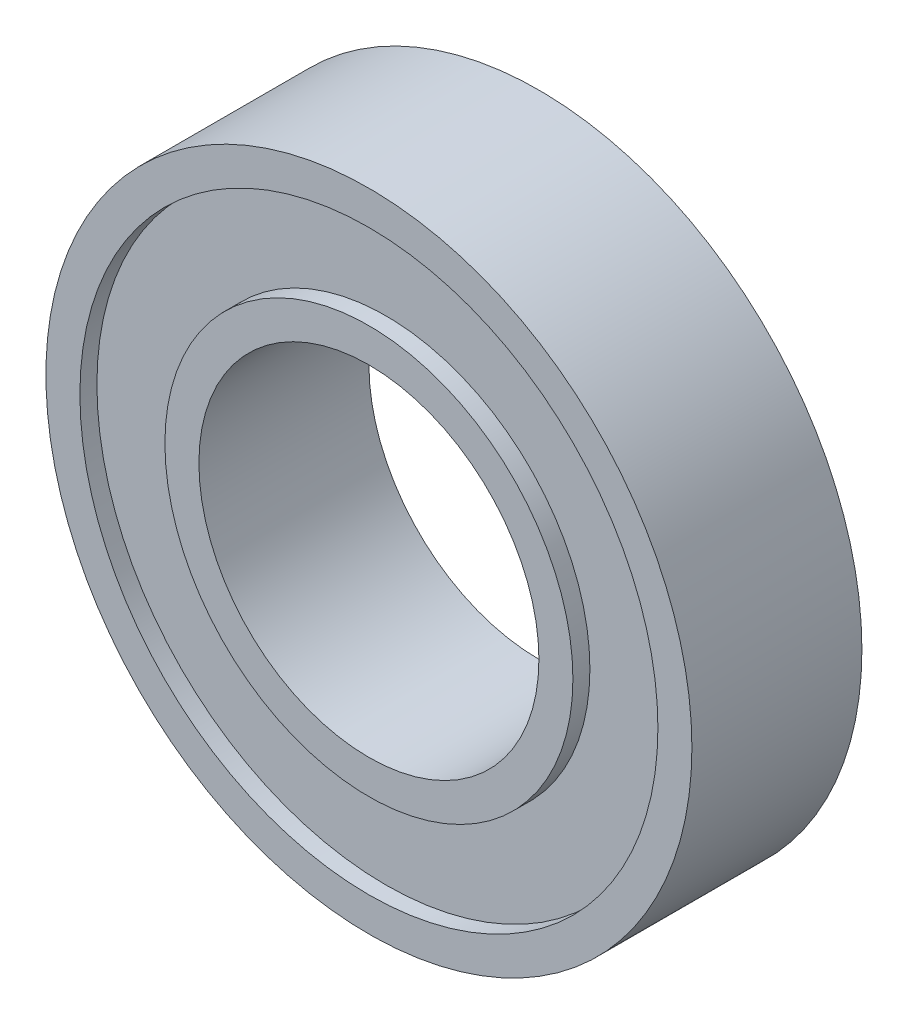
ISO-10303-21;
HEADER;
FILE_DESCRIPTION(('STEP AP214'),'2;1');
FILE_NAME('part.step','',(''),(''),'','','');
FILE_SCHEMA(('AUTOMOTIVE_DESIGN { 1 0 10303 214 1 1 1 1 }'));
ENDSEC;
DATA;
#1=APPLICATION_CONTEXT('core data for automotive mechanical design processes');
#2=APPLICATION_PROTOCOL_DEFINITION('international standard','automotive_design',2000,#1);
#3=PRODUCT_CONTEXT('',#1,'mechanical');
#4=PRODUCT('Part','Part','',(#3));
#5=PRODUCT_RELATED_PRODUCT_CATEGORY('part','',(#4));
#6=PRODUCT_DEFINITION_FORMATION('','',#4);
#7=PRODUCT_DEFINITION_CONTEXT('part definition',#1,'design');
#8=PRODUCT_DEFINITION('design','',#6,#7);
#9=PRODUCT_DEFINITION_SHAPE('','',#8);
#10=(LENGTH_UNIT() NAMED_UNIT(*) SI_UNIT(.MILLI.,.METRE.));
#11=(NAMED_UNIT(*) PLANE_ANGLE_UNIT() SI_UNIT($,.RADIAN.));
#12=(NAMED_UNIT(*) SI_UNIT($,.STERADIAN.) SOLID_ANGLE_UNIT());
#13=UNCERTAINTY_MEASURE_WITH_UNIT(LENGTH_MEASURE(1.E-05),#10,'distance_accuracy_value','');
#14=(GEOMETRIC_REPRESENTATION_CONTEXT(3) GLOBAL_UNCERTAINTY_ASSIGNED_CONTEXT((#13)) GLOBAL_UNIT_ASSIGNED_CONTEXT((#10,
#11,#12)) REPRESENTATION_CONTEXT('',''));
#15=CARTESIAN_POINT('',(0.,0.,0.));
#16=DIRECTION('',(0.,0.,1.));
#17=DIRECTION('',(1.,0.,0.));
#18=AXIS2_PLACEMENT_3D('',#15,#16,#17);
#19=CARTESIAN_POINT('',(0.,9.5,2.5));
#20=DIRECTION('',(0.,0.,-1.));
#21=DIRECTION('',(-1.,0.,0.));
#22=AXIS2_PLACEMENT_3D('',#19,#20,#21);
#23=PLANE('',#22);
#24=CARTESIAN_POINT('',(0.,0.,2.5));
#25=DIRECTION('',(0.,0.,1.));
#26=DIRECTION('',(1.,0.,0.));
#27=AXIS2_PLACEMENT_3D('',#24,#25,#26);
#28=CIRCLE('',#27,8.5);
#29=CARTESIAN_POINT('',(8.5,0.,2.5));
#30=VERTEX_POINT('',#29);
#31=EDGE_CURVE('E10',#30,#30,#28,.T.);
#32=ORIENTED_EDGE('',*,*,#31,.F.);
#33=EDGE_LOOP('',(#32));
#34=FACE_BOUND('',#33,.T.);
#35=CARTESIAN_POINT('',(0.,0.,2.5));
#36=DIRECTION('',(0.,0.,1.));
#37=DIRECTION('',(1.,0.,0.));
#38=AXIS2_PLACEMENT_3D('',#35,#36,#37);
#39=CIRCLE('',#38,9.5);
#40=CARTESIAN_POINT('',(9.5,0.,2.5));
#41=VERTEX_POINT('',#40);
#42=EDGE_CURVE('E72',#41,#41,#39,.T.);
#43=ORIENTED_EDGE('',*,*,#42,.T.);
#44=EDGE_LOOP('',(#43));
#45=FACE_BOUND('',#44,.T.);
#46=ADVANCED_FACE('F32',(#34,#45),#23,.F.);
#47=CARTESIAN_POINT('',(0.,0.,0.));
#48=DIRECTION('',(0.,0.,1.));
#49=DIRECTION('',(1.,0.,0.));
#50=AXIS2_PLACEMENT_3D('',#47,#48,#49);
#51=CYLINDRICAL_SURFACE('',#50,8.5);
#52=CARTESIAN_POINT('',(0.,0.,2.));
#53=DIRECTION('',(0.,0.,1.));
#54=DIRECTION('',(1.,0.,0.));
#55=AXIS2_PLACEMENT_3D('',#52,#53,#54);
#56=CIRCLE('',#55,8.5);
#57=CARTESIAN_POINT('',(8.5,0.,2.));
#58=VERTEX_POINT('',#57);
#59=EDGE_CURVE('E38',#58,#58,#56,.T.);
#60=ORIENTED_EDGE('',*,*,#59,.F.);
#61=EDGE_LOOP('',(#60));
#62=FACE_BOUND('',#61,.T.);
#63=ORIENTED_EDGE('',*,*,#31,.T.);
#64=EDGE_LOOP('',(#63));
#65=FACE_BOUND('',#64,.T.);
#66=ADVANCED_FACE('F133',(#62,#65),#51,.F.);
#67=CARTESIAN_POINT('',(0.,8.5,2.));
#68=DIRECTION('',(0.,0.,-1.));
#69=DIRECTION('',(-1.,0.,0.));
#70=AXIS2_PLACEMENT_3D('',#67,#68,#69);
#71=PLANE('',#70);
#72=CARTESIAN_POINT('',(0.,0.,2.));
#73=DIRECTION('',(0.,0.,1.));
#74=DIRECTION('',(1.,0.,0.));
#75=AXIS2_PLACEMENT_3D('',#72,#73,#74);
#76=CIRCLE('',#75,6.);
#77=CARTESIAN_POINT('',(6.,0.,2.));
#78=VERTEX_POINT('',#77);
#79=EDGE_CURVE('E42',#78,#78,#76,.T.);
#80=ORIENTED_EDGE('',*,*,#79,.F.);
#81=EDGE_LOOP('',(#80));
#82=FACE_BOUND('',#81,.T.);
#83=ORIENTED_EDGE('',*,*,#59,.T.);
#84=EDGE_LOOP('',(#83));
#85=FACE_BOUND('',#84,.T.);
#86=ADVANCED_FACE('F128',(#82,#85),#71,.F.);
#87=CARTESIAN_POINT('',(0.,0.,0.));
#88=DIRECTION('',(0.,0.,1.));
#89=DIRECTION('',(1.,0.,0.));
#90=AXIS2_PLACEMENT_3D('',#87,#88,#89);
#91=CYLINDRICAL_SURFACE('',#90,6.);
#92=CARTESIAN_POINT('',(0.,0.,2.5));
#93=DIRECTION('',(0.,0.,1.));
#94=DIRECTION('',(1.,0.,0.));
#95=AXIS2_PLACEMENT_3D('',#92,#93,#94);
#96=CIRCLE('',#95,6.);
#97=CARTESIAN_POINT('',(6.,0.,2.5));
#98=VERTEX_POINT('',#97);
#99=EDGE_CURVE('E46',#98,#98,#96,.T.);
#100=ORIENTED_EDGE('',*,*,#99,.F.);
#101=EDGE_LOOP('',(#100));
#102=FACE_BOUND('',#101,.T.);
#103=ORIENTED_EDGE('',*,*,#79,.T.);
#104=EDGE_LOOP('',(#103));
#105=FACE_BOUND('',#104,.T.);
#106=ADVANCED_FACE('F122',(#102,#105),#91,.T.);
#107=CARTESIAN_POINT('',(0.,6.,2.5));
#108=DIRECTION('',(0.,0.,-1.));
#109=DIRECTION('',(-1.,0.,0.));
#110=AXIS2_PLACEMENT_3D('',#107,#108,#109);
#111=PLANE('',#110);
#112=CARTESIAN_POINT('',(0.,0.,2.5));
#113=DIRECTION('',(0.,0.,1.));
#114=DIRECTION('',(1.,0.,0.));
#115=AXIS2_PLACEMENT_3D('',#112,#113,#114);
#116=CIRCLE('',#115,5.);
#117=CARTESIAN_POINT('',(5.,0.,2.5));
#118=VERTEX_POINT('',#117);
#119=EDGE_CURVE('E51',#118,#118,#116,.T.);
#120=ORIENTED_EDGE('',*,*,#119,.F.);
#121=EDGE_LOOP('',(#120));
#122=FACE_BOUND('',#121,.T.);
#123=ORIENTED_EDGE('',*,*,#99,.T.);
#124=EDGE_LOOP('',(#123));
#125=FACE_BOUND('',#124,.T.);
#126=ADVANCED_FACE('F116',(#122,#125),#111,.F.);
#127=CARTESIAN_POINT('',(0.,0.,0.));
#128=DIRECTION('',(0.,0.,1.));
#129=DIRECTION('',(1.,0.,0.));
#130=AXIS2_PLACEMENT_3D('',#127,#128,#129);
#131=CYLINDRICAL_SURFACE('',#130,5.);
#132=CARTESIAN_POINT('',(0.,0.,-2.5));
#133=DIRECTION('',(0.,0.,1.));
#134=DIRECTION('',(1.,0.,0.));
#135=AXIS2_PLACEMENT_3D('',#132,#133,#134);
#136=CIRCLE('',#135,5.);
#137=CARTESIAN_POINT('',(5.,0.,-2.5));
#138=VERTEX_POINT('',#137);
#139=EDGE_CURVE('E54',#138,#138,#136,.T.);
#140=ORIENTED_EDGE('',*,*,#139,.F.);
#141=EDGE_LOOP('',(#140));
#142=FACE_BOUND('',#141,.T.);
#143=ORIENTED_EDGE('',*,*,#119,.T.);
#144=EDGE_LOOP('',(#143));
#145=FACE_BOUND('',#144,.T.);
#146=ADVANCED_FACE('F110',(#142,#145),#131,.F.);
#147=CARTESIAN_POINT('',(0.,6.,-2.5));
#148=DIRECTION('',(0.,0.,1.));
#149=DIRECTION('',(1.,0.,0.));
#150=AXIS2_PLACEMENT_3D('',#147,#148,#149);
#151=PLANE('',#150);
#152=CARTESIAN_POINT('',(0.,0.,-2.5));
#153=DIRECTION('',(0.,0.,1.));
#154=DIRECTION('',(1.,0.,0.));
#155=AXIS2_PLACEMENT_3D('',#152,#153,#154);
#156=CIRCLE('',#155,6.);
#157=CARTESIAN_POINT('',(6.,0.,-2.5));
#158=VERTEX_POINT('',#157);
#159=EDGE_CURVE('E57',#158,#158,#156,.T.);
#160=ORIENTED_EDGE('',*,*,#159,.F.);
#161=EDGE_LOOP('',(#160));
#162=FACE_BOUND('',#161,.T.);
#163=ORIENTED_EDGE('',*,*,#139,.T.);
#164=EDGE_LOOP('',(#163));
#165=FACE_BOUND('',#164,.T.);
#166=ADVANCED_FACE('F104',(#162,#165),#151,.F.);
#167=CARTESIAN_POINT('',(0.,0.,0.));
#168=DIRECTION('',(0.,0.,1.));
#169=DIRECTION('',(1.,0.,0.));
#170=AXIS2_PLACEMENT_3D('',#167,#168,#169);
#171=CYLINDRICAL_SURFACE('',#170,6.);
#172=CARTESIAN_POINT('',(0.,0.,-2.));
#173=DIRECTION('',(0.,0.,1.));
#174=DIRECTION('',(1.,0.,0.));
#175=AXIS2_PLACEMENT_3D('',#172,#173,#174);
#176=CIRCLE('',#175,6.);
#177=CARTESIAN_POINT('',(6.,0.,-2.));
#178=VERTEX_POINT('',#177);
#179=EDGE_CURVE('E60',#178,#178,#176,.T.);
#180=ORIENTED_EDGE('',*,*,#179,.F.);
#181=EDGE_LOOP('',(#180));
#182=FACE_BOUND('',#181,.T.);
#183=ORIENTED_EDGE('',*,*,#159,.T.);
#184=EDGE_LOOP('',(#183));
#185=FACE_BOUND('',#184,.T.);
#186=ADVANCED_FACE('F98',(#182,#185),#171,.T.);
#187=CARTESIAN_POINT('',(0.,8.5,-2.));
#188=DIRECTION('',(0.,0.,1.));
#189=DIRECTION('',(1.,0.,0.));
#190=AXIS2_PLACEMENT_3D('',#187,#188,#189);
#191=PLANE('',#190);
#192=CARTESIAN_POINT('',(0.,0.,-2.));
#193=DIRECTION('',(0.,0.,1.));
#194=DIRECTION('',(1.,0.,0.));
#195=AXIS2_PLACEMENT_3D('',#192,#193,#194);
#196=CIRCLE('',#195,8.5);
#197=CARTESIAN_POINT('',(8.5,0.,-2.));
#198=VERTEX_POINT('',#197);
#199=EDGE_CURVE('E63',#198,#198,#196,.T.);
#200=ORIENTED_EDGE('',*,*,#199,.F.);
#201=EDGE_LOOP('',(#200));
#202=FACE_BOUND('',#201,.T.);
#203=ORIENTED_EDGE('',*,*,#179,.T.);
#204=EDGE_LOOP('',(#203));
#205=FACE_BOUND('',#204,.T.);
#206=ADVANCED_FACE('F92',(#202,#205),#191,.F.);
#207=CARTESIAN_POINT('',(0.,0.,0.));
#208=DIRECTION('',(0.,0.,1.));
#209=DIRECTION('',(1.,0.,0.));
#210=AXIS2_PLACEMENT_3D('',#207,#208,#209);
#211=CYLINDRICAL_SURFACE('',#210,8.5);
#212=CARTESIAN_POINT('',(0.,0.,-2.5));
#213=DIRECTION('',(0.,0.,1.));
#214=DIRECTION('',(1.,0.,0.));
#215=AXIS2_PLACEMENT_3D('',#212,#213,#214);
#216=CIRCLE('',#215,8.5);
#217=CARTESIAN_POINT('',(8.5,0.,-2.5));
#218=VERTEX_POINT('',#217);
#219=EDGE_CURVE('E66',#218,#218,#216,.T.);
#220=ORIENTED_EDGE('',*,*,#219,.F.);
#221=EDGE_LOOP('',(#220));
#222=FACE_BOUND('',#221,.T.);
#223=ORIENTED_EDGE('',*,*,#199,.T.);
#224=EDGE_LOOP('',(#223));
#225=FACE_BOUND('',#224,.T.);
#226=ADVANCED_FACE('F86',(#222,#225),#211,.F.);
#227=CARTESIAN_POINT('',(0.,9.5,-2.5));
#228=DIRECTION('',(0.,0.,1.));
#229=DIRECTION('',(1.,0.,0.));
#230=AXIS2_PLACEMENT_3D('',#227,#228,#229);
#231=PLANE('',#230);
#232=CARTESIAN_POINT('',(0.,0.,-2.5));
#233=DIRECTION('',(0.,0.,1.));
#234=DIRECTION('',(1.,0.,0.));
#235=AXIS2_PLACEMENT_3D('',#232,#233,#234);
#236=CIRCLE('',#235,9.5);
#237=CARTESIAN_POINT('',(9.5,0.,-2.5));
#238=VERTEX_POINT('',#237);
#239=EDGE_CURVE('E69',#238,#238,#236,.T.);
#240=ORIENTED_EDGE('',*,*,#239,.F.);
#241=EDGE_LOOP('',(#240));
#242=FACE_BOUND('',#241,.T.);
#243=ORIENTED_EDGE('',*,*,#219,.T.);
#244=EDGE_LOOP('',(#243));
#245=FACE_BOUND('',#244,.T.);
#246=ADVANCED_FACE('F80',(#242,#245),#231,.F.);
#247=CARTESIAN_POINT('',(0.,0.,0.));
#248=DIRECTION('',(0.,0.,1.));
#249=DIRECTION('',(1.,0.,0.));
#250=AXIS2_PLACEMENT_3D('',#247,#248,#249);
#251=CYLINDRICAL_SURFACE('',#250,9.5);
#252=ORIENTED_EDGE('',*,*,#42,.F.);
#253=EDGE_LOOP('',(#252));
#254=FACE_BOUND('',#253,.T.);
#255=ORIENTED_EDGE('',*,*,#239,.T.);
#256=EDGE_LOOP('',(#255));
#257=FACE_BOUND('',#256,.T.);
#258=ADVANCED_FACE('F77',(#254,#257),#251,.T.);
#259=CLOSED_SHELL('',(#46,#66,#86,#106,#126,#146,#166,#186,#206,#226,#246,#258));
#260=MANIFOLD_SOLID_BREP('B2',#259);
#261=ADVANCED_BREP_SHAPE_REPRESENTATION('',(#18,#260),#14);
#262=SHAPE_DEFINITION_REPRESENTATION(#9,#261);
ENDSEC;
END-ISO-10303-21;
